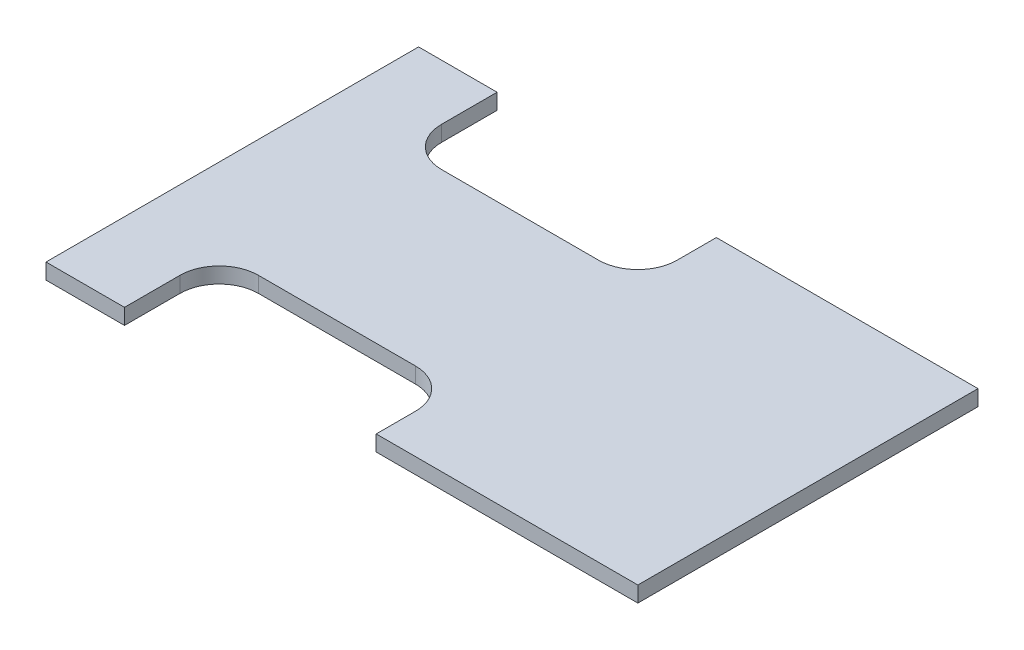
ISO-10303-21;
HEADER;
FILE_DESCRIPTION(('STEP AP214'),'2;1');
FILE_NAME('part.step','',(''),(''),'','','');
FILE_SCHEMA(('AUTOMOTIVE_DESIGN { 1 0 10303 214 1 1 1 1 }'));
ENDSEC;
DATA;
#1=APPLICATION_CONTEXT('core data for automotive mechanical design processes');
#2=APPLICATION_PROTOCOL_DEFINITION('international standard','automotive_design',2000,#1);
#3=PRODUCT_CONTEXT('',#1,'mechanical');
#4=PRODUCT('Part','Part','',(#3));
#5=PRODUCT_RELATED_PRODUCT_CATEGORY('part','',(#4));
#6=PRODUCT_DEFINITION_FORMATION('','',#4);
#7=PRODUCT_DEFINITION_CONTEXT('part definition',#1,'design');
#8=PRODUCT_DEFINITION('design','',#6,#7);
#9=PRODUCT_DEFINITION_SHAPE('','',#8);
#10=(LENGTH_UNIT() NAMED_UNIT(*) SI_UNIT(.MILLI.,.METRE.));
#11=(NAMED_UNIT(*) PLANE_ANGLE_UNIT() SI_UNIT($,.RADIAN.));
#12=(NAMED_UNIT(*) SI_UNIT($,.STERADIAN.) SOLID_ANGLE_UNIT());
#13=UNCERTAINTY_MEASURE_WITH_UNIT(LENGTH_MEASURE(1.E-05),#10,'distance_accuracy_value','');
#14=(GEOMETRIC_REPRESENTATION_CONTEXT(3) GLOBAL_UNCERTAINTY_ASSIGNED_CONTEXT((#13)) GLOBAL_UNIT_ASSIGNED_CONTEXT((#10,
#11,#12)) REPRESENTATION_CONTEXT('',''));
#15=CARTESIAN_POINT('',(0.,0.,0.));
#16=DIRECTION('',(0.,0.,1.));
#17=DIRECTION('',(1.,0.,0.));
#18=AXIS2_PLACEMENT_3D('',#15,#16,#17);
#19=CARTESIAN_POINT('',(110.,6.,-65.));
#20=DIRECTION('',(-1.,0.,0.));
#21=DIRECTION('',(0.,0.,1.));
#22=AXIS2_PLACEMENT_3D('',#19,#20,#21);
#23=PLANE('',#22);
#24=DIRECTION('',(0.,0.,-1.));
#25=VECTOR('',#24,1.);
#26=CARTESIAN_POINT('',(110.,0.,-65.));
#27=LINE('',#26,#25);
#28=CARTESIAN_POINT('',(110.,0.,65.));
#29=VERTEX_POINT('',#28);
#30=CARTESIAN_POINT('',(110.,0.,-65.));
#31=VERTEX_POINT('',#30);
#32=EDGE_CURVE('E210',#29,#31,#27,.T.);
#33=ORIENTED_EDGE('',*,*,#32,.T.);
#34=DIRECTION('',(0.,-1.,0.));
#35=VECTOR('',#34,1.);
#36=CARTESIAN_POINT('',(110.,6.,-65.));
#37=LINE('',#36,#35);
#38=CARTESIAN_POINT('',(110.,6.,-65.));
#39=VERTEX_POINT('',#38);
#40=EDGE_CURVE('E245',#39,#31,#37,.T.);
#41=ORIENTED_EDGE('',*,*,#40,.F.);
#42=DIRECTION('',(0.,0.,-1.));
#43=VECTOR('',#42,1.);
#44=CARTESIAN_POINT('',(110.,6.,-65.));
#45=LINE('',#44,#43);
#46=CARTESIAN_POINT('',(110.,6.,65.));
#47=VERTEX_POINT('',#46);
#48=EDGE_CURVE('E223',#47,#39,#45,.T.);
#49=ORIENTED_EDGE('',*,*,#48,.F.);
#50=DIRECTION('',(0.,-1.,0.));
#51=VECTOR('',#50,1.);
#52=CARTESIAN_POINT('',(110.,6.,65.));
#53=LINE('',#52,#51);
#54=EDGE_CURVE('E234',#47,#29,#53,.T.);
#55=ORIENTED_EDGE('',*,*,#54,.T.);
#56=EDGE_LOOP('',(#33,#41,#49,#55));
#57=FACE_BOUND('',#56,.T.);
#58=ADVANCED_FACE('F40',(#57),#23,.F.);
#59=CARTESIAN_POINT('',(-110.,6.,-65.));
#60=DIRECTION('',(0.,0.,1.));
#61=DIRECTION('',(1.,0.,0.));
#62=AXIS2_PLACEMENT_3D('',#59,#60,#61);
#63=PLANE('',#62);
#64=DIRECTION('',(-1.,0.,0.));
#65=VECTOR('',#64,1.);
#66=CARTESIAN_POINT('',(-110.,0.,-65.));
#67=LINE('',#66,#65);
#68=CARTESIAN_POINT('',(9.99999999999998,0.,-65.));
#69=VERTEX_POINT('',#68);
#70=EDGE_CURVE('E237',#31,#69,#67,.T.);
#71=ORIENTED_EDGE('',*,*,#70,.T.);
#72=DIRECTION('',(0.,1.,0.));
#73=VECTOR('',#72,1.);
#74=CARTESIAN_POINT('',(9.99999999999998,0.,-65.));
#75=LINE('',#74,#73);
#76=CARTESIAN_POINT('',(9.99999999999998,6.,-65.));
#77=VERTEX_POINT('',#76);
#78=EDGE_CURVE('E186',#69,#77,#75,.T.);
#79=ORIENTED_EDGE('',*,*,#78,.T.);
#80=DIRECTION('',(-1.,0.,0.));
#81=VECTOR('',#80,1.);
#82=CARTESIAN_POINT('',(-110.,6.,-65.));
#83=LINE('',#82,#81);
#84=EDGE_CURVE('E226',#39,#77,#83,.T.);
#85=ORIENTED_EDGE('',*,*,#84,.F.);
#86=ORIENTED_EDGE('',*,*,#40,.T.);
#87=EDGE_LOOP('',(#71,#79,#85,#86));
#88=FACE_BOUND('',#87,.T.);
#89=ADVANCED_FACE('F308',(#88),#63,.F.);
#90=CARTESIAN_POINT('',(-110.,6.,-65.));
#91=DIRECTION('',(1.,0.,0.));
#92=DIRECTION('',(0.,0.,-1.));
#93=AXIS2_PLACEMENT_3D('',#90,#91,#92);
#94=PLANE('',#93);
#95=DIRECTION('',(0.,0.,1.));
#96=VECTOR('',#95,1.);
#97=CARTESIAN_POINT('',(-110.,0.,-65.));
#98=LINE('',#97,#96);
#99=CARTESIAN_POINT('',(-110.,0.,-71.1999999999999));
#100=VERTEX_POINT('',#99);
#101=CARTESIAN_POINT('',(-110.,0.,71.2));
#102=VERTEX_POINT('',#101);
#103=EDGE_CURVE('E240',#100,#102,#98,.T.);
#104=ORIENTED_EDGE('',*,*,#103,.T.);
#105=DIRECTION('',(0.,1.,0.));
#106=VECTOR('',#105,1.);
#107=CARTESIAN_POINT('',(-110.,-30.6339680746717,71.2));
#108=LINE('',#107,#106);
#109=CARTESIAN_POINT('',(-110.,6.,71.2));
#110=VERTEX_POINT('',#109);
#111=EDGE_CURVE('E180',#102,#110,#108,.T.);
#112=ORIENTED_EDGE('',*,*,#111,.T.);
#113=DIRECTION('',(0.,0.,1.));
#114=VECTOR('',#113,1.);
#115=CARTESIAN_POINT('',(-110.,6.,-65.));
#116=LINE('',#115,#114);
#117=CARTESIAN_POINT('',(-110.,6.,-71.1999999999999));
#118=VERTEX_POINT('',#117);
#119=EDGE_CURVE('E230',#118,#110,#116,.T.);
#120=ORIENTED_EDGE('',*,*,#119,.F.);
#121=DIRECTION('',(0.,1.,0.));
#122=VECTOR('',#121,1.);
#123=CARTESIAN_POINT('',(-110.,-30.6339680746717,-71.1999999999999));
#124=LINE('',#123,#122);
#125=EDGE_CURVE('E172',#100,#118,#124,.T.);
#126=ORIENTED_EDGE('',*,*,#125,.F.);
#127=EDGE_LOOP('',(#104,#112,#120,#126));
#128=FACE_BOUND('',#127,.T.);
#129=ADVANCED_FACE('F327',(#128),#94,.F.);
#130=CARTESIAN_POINT('',(-110.,6.,65.));
#131=DIRECTION('',(0.,0.,-1.));
#132=DIRECTION('',(-1.,0.,0.));
#133=AXIS2_PLACEMENT_3D('',#130,#131,#132);
#134=PLANE('',#133);
#135=DIRECTION('',(1.,0.,0.));
#136=VECTOR('',#135,1.);
#137=CARTESIAN_POINT('',(-110.,6.,65.));
#138=LINE('',#137,#136);
#139=CARTESIAN_POINT('',(9.99999999999999,6.,65.));
#140=VERTEX_POINT('',#139);
#141=EDGE_CURVE('E232',#140,#47,#138,.T.);
#142=ORIENTED_EDGE('',*,*,#141,.F.);
#143=DIRECTION('',(0.,1.,0.));
#144=VECTOR('',#143,1.);
#145=CARTESIAN_POINT('',(9.99999999999999,0.,65.));
#146=LINE('',#145,#144);
#147=CARTESIAN_POINT('',(9.99999999999999,0.,65.));
#148=VERTEX_POINT('',#147);
#149=EDGE_CURVE('E203',#148,#140,#146,.T.);
#150=ORIENTED_EDGE('',*,*,#149,.F.);
#151=DIRECTION('',(1.,0.,0.));
#152=VECTOR('',#151,1.);
#153=CARTESIAN_POINT('',(-110.,0.,65.));
#154=LINE('',#153,#152);
#155=EDGE_CURVE('E227',#148,#29,#154,.T.);
#156=ORIENTED_EDGE('',*,*,#155,.T.);
#157=ORIENTED_EDGE('',*,*,#54,.F.);
#158=EDGE_LOOP('',(#142,#150,#156,#157));
#159=FACE_BOUND('',#158,.T.);
#160=ADVANCED_FACE('F301',(#159),#134,.F.);
#161=CARTESIAN_POINT('',(0.,6.,0.));
#162=DIRECTION('',(0.,1.,0.));
#163=DIRECTION('',(0.,0.,1.));
#164=AXIS2_PLACEMENT_3D('',#161,#162,#163);
#165=PLANE('',#164);
#166=DIRECTION('',(0.,0.,1.));
#167=VECTOR('',#166,1.);
#168=CARTESIAN_POINT('',(-80.,6.,65.));
#169=LINE('',#168,#167);
#170=CARTESIAN_POINT('',(-80.,6.,50.));
#171=VERTEX_POINT('',#170);
#172=CARTESIAN_POINT('',(-80.,6.,71.2));
#173=VERTEX_POINT('',#172);
#174=EDGE_CURVE('E161',#171,#173,#169,.T.);
#175=ORIENTED_EDGE('',*,*,#174,.F.);
#176=CARTESIAN_POINT('',(-65.,6.,50.));
#177=DIRECTION('',(0.,1.,0.));
#178=DIRECTION('',(0.,0.,1.));
#179=AXIS2_PLACEMENT_3D('',#176,#177,#178);
#180=CIRCLE('',#179,15.);
#181=CARTESIAN_POINT('',(-65.,6.,35.));
#182=VERTEX_POINT('',#181);
#183=EDGE_CURVE('E274',#171,#182,#180,.F.);
#184=ORIENTED_EDGE('',*,*,#183,.T.);
#185=DIRECTION('',(-1.,0.,0.));
#186=VECTOR('',#185,1.);
#187=CARTESIAN_POINT('',(-80.,6.,35.));
#188=LINE('',#187,#186);
#189=CARTESIAN_POINT('',(-5.00000000000003,6.,35.));
#190=VERTEX_POINT('',#189);
#191=EDGE_CURVE('E198',#190,#182,#188,.T.);
#192=ORIENTED_EDGE('',*,*,#191,.F.);
#193=CARTESIAN_POINT('',(-5.,6.,50.));
#194=DIRECTION('',(0.,1.,0.));
#195=DIRECTION('',(0.,0.,1.));
#196=AXIS2_PLACEMENT_3D('',#193,#194,#195);
#197=CIRCLE('',#196,15.);
#198=CARTESIAN_POINT('',(9.99999999999999,6.,50.));
#199=VERTEX_POINT('',#198);
#200=EDGE_CURVE('E48',#190,#199,#197,.F.);
#201=ORIENTED_EDGE('',*,*,#200,.T.);
#202=DIRECTION('',(0.,0.,-1.));
#203=VECTOR('',#202,1.);
#204=CARTESIAN_POINT('',(9.99999999999999,6.,65.));
#205=LINE('',#204,#203);
#206=EDGE_CURVE('E205',#140,#199,#205,.T.);
#207=ORIENTED_EDGE('',*,*,#206,.F.);
#208=ORIENTED_EDGE('',*,*,#141,.T.);
#209=ORIENTED_EDGE('',*,*,#48,.T.);
#210=ORIENTED_EDGE('',*,*,#84,.T.);
#211=DIRECTION('',(0.,0.,-1.));
#212=VECTOR('',#211,1.);
#213=CARTESIAN_POINT('',(9.99999999999998,6.,-65.));
#214=LINE('',#213,#212);
#215=CARTESIAN_POINT('',(9.99999999999998,6.,-50.));
#216=VERTEX_POINT('',#215);
#217=EDGE_CURVE('E214',#216,#77,#214,.T.);
#218=ORIENTED_EDGE('',*,*,#217,.F.);
#219=CARTESIAN_POINT('',(-5.00000000000002,6.,-50.));
#220=DIRECTION('',(0.,1.,0.));
#221=DIRECTION('',(0.,0.,1.));
#222=AXIS2_PLACEMENT_3D('',#219,#220,#221);
#223=CIRCLE('',#222,15.);
#224=CARTESIAN_POINT('',(-5.00000000000005,6.,-35.));
#225=VERTEX_POINT('',#224);
#226=EDGE_CURVE('E267',#216,#225,#223,.F.);
#227=ORIENTED_EDGE('',*,*,#226,.T.);
#228=DIRECTION('',(1.,0.,0.));
#229=VECTOR('',#228,1.);
#230=CARTESIAN_POINT('',(-80.,6.,-35.));
#231=LINE('',#230,#229);
#232=CARTESIAN_POINT('',(-65.,6.,-35.));
#233=VERTEX_POINT('',#232);
#234=EDGE_CURVE('E162',#233,#225,#231,.T.);
#235=ORIENTED_EDGE('',*,*,#234,.F.);
#236=CARTESIAN_POINT('',(-65.,6.,-50.));
#237=DIRECTION('',(0.,1.,0.));
#238=DIRECTION('',(0.,0.,1.));
#239=AXIS2_PLACEMENT_3D('',#236,#237,#238);
#240=CIRCLE('',#239,15.);
#241=CARTESIAN_POINT('',(-80.,6.,-50.));
#242=VERTEX_POINT('',#241);
#243=EDGE_CURVE('E158',#233,#242,#240,.F.);
#244=ORIENTED_EDGE('',*,*,#243,.T.);
#245=DIRECTION('',(0.,0.,1.));
#246=VECTOR('',#245,1.);
#247=CARTESIAN_POINT('',(-80.,6.,-64.9999999999999));
#248=LINE('',#247,#246);
#249=CARTESIAN_POINT('',(-80.,6.,-71.1999999999999));
#250=VERTEX_POINT('',#249);
#251=EDGE_CURVE('E151',#250,#242,#248,.T.);
#252=ORIENTED_EDGE('',*,*,#251,.F.);
#253=DIRECTION('',(-1.,0.,0.));
#254=VECTOR('',#253,1.);
#255=CARTESIAN_POINT('',(-80.,6.,-71.1999999999999));
#256=LINE('',#255,#254);
#257=EDGE_CURVE('E156',#250,#118,#256,.T.);
#258=ORIENTED_EDGE('',*,*,#257,.T.);
#259=ORIENTED_EDGE('',*,*,#119,.T.);
#260=DIRECTION('',(1.,0.,0.));
#261=VECTOR('',#260,1.);
#262=CARTESIAN_POINT('',(-80.,6.,71.2));
#263=LINE('',#262,#261);
#264=EDGE_CURVE('E177',#110,#173,#263,.T.);
#265=ORIENTED_EDGE('',*,*,#264,.T.);
#266=EDGE_LOOP('',(#175,#184,#192,#201,#207,#208,#209,#210,#218,#227,#235,#244,#252,#258,#259,#265));
#267=FACE_BOUND('',#266,.T.);
#268=ADVANCED_FACE('F154',(#267),#165,.T.);
#269=CARTESIAN_POINT('',(0.,0.,0.));
#270=DIRECTION('',(0.,1.,0.));
#271=DIRECTION('',(0.,0.,1.));
#272=AXIS2_PLACEMENT_3D('',#269,#270,#271);
#273=PLANE('',#272);
#274=DIRECTION('',(0.,0.,-1.));
#275=VECTOR('',#274,1.);
#276=CARTESIAN_POINT('',(9.99999999999999,0.,65.));
#277=LINE('',#276,#275);
#278=CARTESIAN_POINT('',(9.99999999999999,0.,50.));
#279=VERTEX_POINT('',#278);
#280=EDGE_CURVE('E197',#148,#279,#277,.T.);
#281=ORIENTED_EDGE('',*,*,#280,.T.);
#282=CARTESIAN_POINT('',(-5.,0.,50.));
#283=DIRECTION('',(0.,1.,0.));
#284=DIRECTION('',(0.,0.,1.));
#285=AXIS2_PLACEMENT_3D('',#282,#283,#284);
#286=CIRCLE('',#285,15.);
#287=CARTESIAN_POINT('',(-5.00000000000003,0.,35.));
#288=VERTEX_POINT('',#287);
#289=EDGE_CURVE('E11',#279,#288,#286,.T.);
#290=ORIENTED_EDGE('',*,*,#289,.T.);
#291=DIRECTION('',(-1.,0.,0.));
#292=VECTOR('',#291,1.);
#293=CARTESIAN_POINT('',(-80.,0.,35.));
#294=LINE('',#293,#292);
#295=CARTESIAN_POINT('',(-65.,0.,35.));
#296=VERTEX_POINT('',#295);
#297=EDGE_CURVE('E200',#288,#296,#294,.T.);
#298=ORIENTED_EDGE('',*,*,#297,.T.);
#299=CARTESIAN_POINT('',(-65.,0.,50.));
#300=DIRECTION('',(0.,1.,0.));
#301=DIRECTION('',(0.,0.,1.));
#302=AXIS2_PLACEMENT_3D('',#299,#300,#301);
#303=CIRCLE('',#302,15.);
#304=CARTESIAN_POINT('',(-80.,0.,50.));
#305=VERTEX_POINT('',#304);
#306=EDGE_CURVE('E276',#296,#305,#303,.T.);
#307=ORIENTED_EDGE('',*,*,#306,.T.);
#308=DIRECTION('',(0.,0.,1.));
#309=VECTOR('',#308,1.);
#310=CARTESIAN_POINT('',(-80.,0.,65.));
#311=LINE('',#310,#309);
#312=CARTESIAN_POINT('',(-80.,0.,71.2));
#313=VERTEX_POINT('',#312);
#314=EDGE_CURVE('E195',#305,#313,#311,.T.);
#315=ORIENTED_EDGE('',*,*,#314,.T.);
#316=DIRECTION('',(-1.,0.,0.));
#317=VECTOR('',#316,1.);
#318=CARTESIAN_POINT('',(-80.,0.,71.2));
#319=LINE('',#318,#317);
#320=EDGE_CURVE('E191',#313,#102,#319,.T.);
#321=ORIENTED_EDGE('',*,*,#320,.T.);
#322=ORIENTED_EDGE('',*,*,#103,.F.);
#323=DIRECTION('',(1.,0.,0.));
#324=VECTOR('',#323,1.);
#325=CARTESIAN_POINT('',(-80.,0.,-71.1999999999999));
#326=LINE('',#325,#324);
#327=CARTESIAN_POINT('',(-80.,0.,-71.1999999999999));
#328=VERTEX_POINT('',#327);
#329=EDGE_CURVE('E183',#100,#328,#326,.T.);
#330=ORIENTED_EDGE('',*,*,#329,.T.);
#331=DIRECTION('',(0.,0.,1.));
#332=VECTOR('',#331,1.);
#333=CARTESIAN_POINT('',(-80.,0.,-64.9999999999999));
#334=LINE('',#333,#332);
#335=CARTESIAN_POINT('',(-80.,0.,-50.));
#336=VERTEX_POINT('',#335);
#337=EDGE_CURVE('E168',#328,#336,#334,.T.);
#338=ORIENTED_EDGE('',*,*,#337,.T.);
#339=CARTESIAN_POINT('',(-65.,0.,-50.));
#340=DIRECTION('',(0.,1.,0.));
#341=DIRECTION('',(0.,0.,1.));
#342=AXIS2_PLACEMENT_3D('',#339,#340,#341);
#343=CIRCLE('',#342,15.);
#344=CARTESIAN_POINT('',(-65.,0.,-35.));
#345=VERTEX_POINT('',#344);
#346=EDGE_CURVE('E272',#336,#345,#343,.T.);
#347=ORIENTED_EDGE('',*,*,#346,.T.);
#348=DIRECTION('',(1.,0.,0.));
#349=VECTOR('',#348,1.);
#350=CARTESIAN_POINT('',(-80.,0.,-35.));
#351=LINE('',#350,#349);
#352=CARTESIAN_POINT('',(-5.00000000000005,0.,-35.));
#353=VERTEX_POINT('',#352);
#354=EDGE_CURVE('E219',#345,#353,#351,.T.);
#355=ORIENTED_EDGE('',*,*,#354,.T.);
#356=CARTESIAN_POINT('',(-5.00000000000002,0.,-50.));
#357=DIRECTION('',(0.,1.,0.));
#358=DIRECTION('',(0.,0.,1.));
#359=AXIS2_PLACEMENT_3D('',#356,#357,#358);
#360=CIRCLE('',#359,15.);
#361=CARTESIAN_POINT('',(9.99999999999998,0.,-50.));
#362=VERTEX_POINT('',#361);
#363=EDGE_CURVE('E269',#353,#362,#360,.T.);
#364=ORIENTED_EDGE('',*,*,#363,.T.);
#365=DIRECTION('',(0.,0.,-1.));
#366=VECTOR('',#365,1.);
#367=CARTESIAN_POINT('',(9.99999999999998,0.,-65.));
#368=LINE('',#367,#366);
#369=EDGE_CURVE('E213',#362,#69,#368,.T.);
#370=ORIENTED_EDGE('',*,*,#369,.T.);
#371=ORIENTED_EDGE('',*,*,#70,.F.);
#372=ORIENTED_EDGE('',*,*,#32,.F.);
#373=ORIENTED_EDGE('',*,*,#155,.F.);
#374=EDGE_LOOP('',(#281,#290,#298,#307,#315,#321,#322,#330,#338,#347,#355,#364,#370,#371,#372,#373));
#375=FACE_BOUND('',#374,.T.);
#376=ADVANCED_FACE('F280',(#375),#273,.F.);
#377=CARTESIAN_POINT('',(-80.,0.,-64.9999999999999));
#378=DIRECTION('',(-1.,0.,0.));
#379=DIRECTION('',(0.,0.,1.));
#380=AXIS2_PLACEMENT_3D('',#377,#378,#379);
#381=PLANE('',#380);
#382=ORIENTED_EDGE('',*,*,#251,.T.);
#383=DIRECTION('',(0.,1.,0.));
#384=VECTOR('',#383,1.);
#385=CARTESIAN_POINT('',(-80.,0.,-50.));
#386=LINE('',#385,#384);
#387=EDGE_CURVE('E256',#242,#336,#386,.F.);
#388=ORIENTED_EDGE('',*,*,#387,.T.);
#389=ORIENTED_EDGE('',*,*,#337,.F.);
#390=DIRECTION('',(0.,1.,0.));
#391=VECTOR('',#390,1.);
#392=CARTESIAN_POINT('',(-80.,-30.6339680746717,-71.1999999999999));
#393=LINE('',#392,#391);
#394=EDGE_CURVE('E165',#328,#250,#393,.T.);
#395=ORIENTED_EDGE('',*,*,#394,.T.);
#396=EDGE_LOOP('',(#382,#388,#389,#395));
#397=FACE_BOUND('',#396,.T.);
#398=ADVANCED_FACE('F166',(#397),#381,.F.);
#399=CARTESIAN_POINT('',(9.99999999999998,0.,-65.));
#400=DIRECTION('',(1.,0.,0.));
#401=DIRECTION('',(0.,0.,-1.));
#402=AXIS2_PLACEMENT_3D('',#399,#400,#401);
#403=PLANE('',#402);
#404=ORIENTED_EDGE('',*,*,#369,.F.);
#405=DIRECTION('',(0.,1.,0.));
#406=VECTOR('',#405,1.);
#407=CARTESIAN_POINT('',(9.99999999999998,6.,-50.));
#408=LINE('',#407,#406);
#409=EDGE_CURVE('E248',#362,#216,#408,.T.);
#410=ORIENTED_EDGE('',*,*,#409,.T.);
#411=ORIENTED_EDGE('',*,*,#217,.T.);
#412=ORIENTED_EDGE('',*,*,#78,.F.);
#413=EDGE_LOOP('',(#404,#410,#411,#412));
#414=FACE_BOUND('',#413,.T.);
#415=ADVANCED_FACE('F312',(#414),#403,.F.);
#416=CARTESIAN_POINT('',(-80.,0.,-35.));
#417=DIRECTION('',(0.,0.,1.));
#418=DIRECTION('',(1.,0.,0.));
#419=AXIS2_PLACEMENT_3D('',#416,#417,#418);
#420=PLANE('',#419);
#421=ORIENTED_EDGE('',*,*,#234,.T.);
#422=DIRECTION('',(0.,1.,0.));
#423=VECTOR('',#422,1.);
#424=CARTESIAN_POINT('',(-5.00000000000001,0.,-35.));
#425=LINE('',#424,#423);
#426=EDGE_CURVE('E254',#225,#353,#425,.F.);
#427=ORIENTED_EDGE('',*,*,#426,.T.);
#428=ORIENTED_EDGE('',*,*,#354,.F.);
#429=DIRECTION('',(0.,1.,0.));
#430=VECTOR('',#429,1.);
#431=CARTESIAN_POINT('',(-65.,6.,-35.));
#432=LINE('',#431,#430);
#433=EDGE_CURVE('E251',#345,#233,#432,.T.);
#434=ORIENTED_EDGE('',*,*,#433,.T.);
#435=EDGE_LOOP('',(#421,#427,#428,#434));
#436=FACE_BOUND('',#435,.T.);
#437=ADVANCED_FACE('F317',(#436),#420,.F.);
#438=CARTESIAN_POINT('',(-80.,0.,65.));
#439=DIRECTION('',(-1.,0.,0.));
#440=DIRECTION('',(0.,0.,1.));
#441=AXIS2_PLACEMENT_3D('',#438,#439,#440);
#442=PLANE('',#441);
#443=ORIENTED_EDGE('',*,*,#314,.F.);
#444=DIRECTION('',(0.,1.,0.));
#445=VECTOR('',#444,1.);
#446=CARTESIAN_POINT('',(-80.,6.,50.));
#447=LINE('',#446,#445);
#448=EDGE_CURVE('E258',#305,#171,#447,.T.);
#449=ORIENTED_EDGE('',*,*,#448,.T.);
#450=ORIENTED_EDGE('',*,*,#174,.T.);
#451=DIRECTION('',(0.,1.,0.));
#452=VECTOR('',#451,1.);
#453=CARTESIAN_POINT('',(-80.,-30.6339680746717,71.2));
#454=LINE('',#453,#452);
#455=EDGE_CURVE('E189',#313,#173,#454,.T.);
#456=ORIENTED_EDGE('',*,*,#455,.F.);
#457=EDGE_LOOP('',(#443,#449,#450,#456));
#458=FACE_BOUND('',#457,.T.);
#459=ADVANCED_FACE('F288',(#458),#442,.F.);
#460=CARTESIAN_POINT('',(-80.,0.,35.));
#461=DIRECTION('',(0.,0.,-1.));
#462=DIRECTION('',(-1.,0.,0.));
#463=AXIS2_PLACEMENT_3D('',#460,#461,#462);
#464=PLANE('',#463);
#465=ORIENTED_EDGE('',*,*,#191,.T.);
#466=DIRECTION('',(0.,1.,0.));
#467=VECTOR('',#466,1.);
#468=CARTESIAN_POINT('',(-65.,0.,35.));
#469=LINE('',#468,#467);
#470=EDGE_CURVE('E264',#182,#296,#469,.F.);
#471=ORIENTED_EDGE('',*,*,#470,.T.);
#472=ORIENTED_EDGE('',*,*,#297,.F.);
#473=DIRECTION('',(0.,1.,0.));
#474=VECTOR('',#473,1.);
#475=CARTESIAN_POINT('',(-5.,6.,35.));
#476=LINE('',#475,#474);
#477=EDGE_CURVE('E261',#288,#190,#476,.T.);
#478=ORIENTED_EDGE('',*,*,#477,.T.);
#479=EDGE_LOOP('',(#465,#471,#472,#478));
#480=FACE_BOUND('',#479,.T.);
#481=ADVANCED_FACE('F291',(#480),#464,.F.);
#482=CARTESIAN_POINT('',(9.99999999999999,0.,65.));
#483=DIRECTION('',(1.,0.,0.));
#484=DIRECTION('',(0.,0.,-1.));
#485=AXIS2_PLACEMENT_3D('',#482,#483,#484);
#486=PLANE('',#485);
#487=ORIENTED_EDGE('',*,*,#206,.T.);
#488=DIRECTION('',(0.,1.,0.));
#489=VECTOR('',#488,1.);
#490=CARTESIAN_POINT('',(9.99999999999999,0.,50.));
#491=LINE('',#490,#489);
#492=EDGE_CURVE('E55',#199,#279,#491,.F.);
#493=ORIENTED_EDGE('',*,*,#492,.T.);
#494=ORIENTED_EDGE('',*,*,#280,.F.);
#495=ORIENTED_EDGE('',*,*,#149,.T.);
#496=EDGE_LOOP('',(#487,#493,#494,#495));
#497=FACE_BOUND('',#496,.T.);
#498=ADVANCED_FACE('F298',(#497),#486,.F.);
#499=CARTESIAN_POINT('',(-5.00000000000002,0.,-50.));
#500=DIRECTION('',(0.,-1.,0.));
#501=DIRECTION('',(0.,0.,-1.));
#502=AXIS2_PLACEMENT_3D('',#499,#500,#501);
#503=CYLINDRICAL_SURFACE('',#502,15.);
#504=ORIENTED_EDGE('',*,*,#363,.F.);
#505=ORIENTED_EDGE('',*,*,#426,.F.);
#506=ORIENTED_EDGE('',*,*,#226,.F.);
#507=ORIENTED_EDGE('',*,*,#409,.F.);
#508=EDGE_LOOP('',(#504,#505,#506,#507));
#509=FACE_BOUND('',#508,.T.);
#510=ADVANCED_FACE('F321',(#509),#503,.F.);
#511=CARTESIAN_POINT('',(-65.,0.,-50.));
#512=DIRECTION('',(0.,-1.,0.));
#513=DIRECTION('',(0.,0.,-1.));
#514=AXIS2_PLACEMENT_3D('',#511,#512,#513);
#515=CYLINDRICAL_SURFACE('',#514,15.);
#516=ORIENTED_EDGE('',*,*,#346,.F.);
#517=ORIENTED_EDGE('',*,*,#387,.F.);
#518=ORIENTED_EDGE('',*,*,#243,.F.);
#519=ORIENTED_EDGE('',*,*,#433,.F.);
#520=EDGE_LOOP('',(#516,#517,#518,#519));
#521=FACE_BOUND('',#520,.T.);
#522=ADVANCED_FACE('F324',(#521),#515,.F.);
#523=CARTESIAN_POINT('',(-65.,0.,50.));
#524=DIRECTION('',(0.,-1.,0.));
#525=DIRECTION('',(0.,0.,-1.));
#526=AXIS2_PLACEMENT_3D('',#523,#524,#525);
#527=CYLINDRICAL_SURFACE('',#526,15.);
#528=ORIENTED_EDGE('',*,*,#306,.F.);
#529=ORIENTED_EDGE('',*,*,#470,.F.);
#530=ORIENTED_EDGE('',*,*,#183,.F.);
#531=ORIENTED_EDGE('',*,*,#448,.F.);
#532=EDGE_LOOP('',(#528,#529,#530,#531));
#533=FACE_BOUND('',#532,.T.);
#534=ADVANCED_FACE('F289',(#533),#527,.F.);
#535=CARTESIAN_POINT('',(-5.,0.,50.));
#536=DIRECTION('',(0.,-1.,0.));
#537=DIRECTION('',(0.,0.,-1.));
#538=AXIS2_PLACEMENT_3D('',#535,#536,#537);
#539=CYLINDRICAL_SURFACE('',#538,15.);
#540=ORIENTED_EDGE('',*,*,#289,.F.);
#541=ORIENTED_EDGE('',*,*,#492,.F.);
#542=ORIENTED_EDGE('',*,*,#200,.F.);
#543=ORIENTED_EDGE('',*,*,#477,.F.);
#544=EDGE_LOOP('',(#540,#541,#542,#543));
#545=FACE_BOUND('',#544,.T.);
#546=ADVANCED_FACE('F42',(#545),#539,.F.);
#547=CARTESIAN_POINT('',(-80.,-30.6339680746717,71.2));
#548=DIRECTION('',(0.,0.,1.));
#549=DIRECTION('',(1.,0.,0.));
#550=AXIS2_PLACEMENT_3D('',#547,#548,#549);
#551=PLANE('',#550);
#552=ORIENTED_EDGE('',*,*,#320,.F.);
#553=ORIENTED_EDGE('',*,*,#455,.T.);
#554=ORIENTED_EDGE('',*,*,#264,.F.);
#555=ORIENTED_EDGE('',*,*,#111,.F.);
#556=EDGE_LOOP('',(#552,#553,#554,#555));
#557=FACE_BOUND('',#556,.T.);
#558=ADVANCED_FACE('F330',(#557),#551,.T.);
#559=CARTESIAN_POINT('',(-80.,-30.6339680746717,-71.1999999999999));
#560=DIRECTION('',(0.,0.,-1.));
#561=DIRECTION('',(-1.,0.,0.));
#562=AXIS2_PLACEMENT_3D('',#559,#560,#561);
#563=PLANE('',#562);
#564=ORIENTED_EDGE('',*,*,#329,.F.);
#565=ORIENTED_EDGE('',*,*,#125,.T.);
#566=ORIENTED_EDGE('',*,*,#257,.F.);
#567=ORIENTED_EDGE('',*,*,#394,.F.);
#568=EDGE_LOOP('',(#564,#565,#566,#567));
#569=FACE_BOUND('',#568,.T.);
#570=ADVANCED_FACE('F175',(#569),#563,.T.);
#571=CLOSED_SHELL('',(#58,#89,#129,#160,#268,#376,#398,#415,#437,#459,#481,#498,#510,#522,#534,
#546,#558,#570));
#572=MANIFOLD_SOLID_BREP('B2',#571);
#573=ADVANCED_BREP_SHAPE_REPRESENTATION('',(#18,#572),#14);
#574=SHAPE_DEFINITION_REPRESENTATION(#9,#573);
ENDSEC;
END-ISO-10303-21;
